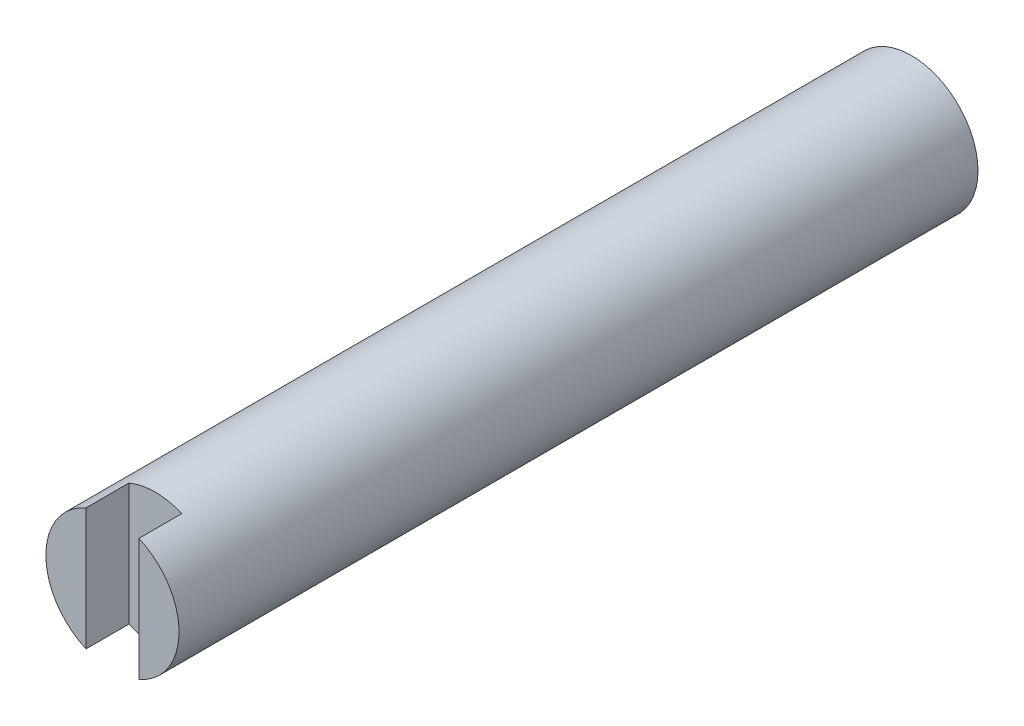
ISO-10303-21;
HEADER;
FILE_DESCRIPTION(('STEP AP214'),'2;1');
FILE_NAME('part.step','',(''),(''),'','','');
FILE_SCHEMA(('AUTOMOTIVE_DESIGN { 1 0 10303 214 1 1 1 1 }'));
ENDSEC;
DATA;
#1=APPLICATION_CONTEXT('core data for automotive mechanical design processes');
#2=APPLICATION_PROTOCOL_DEFINITION('international standard','automotive_design',2000,#1);
#3=PRODUCT_CONTEXT('',#1,'mechanical');
#4=PRODUCT('Part','Part','',(#3));
#5=PRODUCT_RELATED_PRODUCT_CATEGORY('part','',(#4));
#6=PRODUCT_DEFINITION_FORMATION('','',#4);
#7=PRODUCT_DEFINITION_CONTEXT('part definition',#1,'design');
#8=PRODUCT_DEFINITION('design','',#6,#7);
#9=PRODUCT_DEFINITION_SHAPE('','',#8);
#10=(LENGTH_UNIT() NAMED_UNIT(*) SI_UNIT(.MILLI.,.METRE.));
#11=(NAMED_UNIT(*) PLANE_ANGLE_UNIT() SI_UNIT($,.RADIAN.));
#12=(NAMED_UNIT(*) SI_UNIT($,.STERADIAN.) SOLID_ANGLE_UNIT());
#13=UNCERTAINTY_MEASURE_WITH_UNIT(LENGTH_MEASURE(1.E-05),#10,'distance_accuracy_value','');
#14=(GEOMETRIC_REPRESENTATION_CONTEXT(3) GLOBAL_UNCERTAINTY_ASSIGNED_CONTEXT((#13)) GLOBAL_UNIT_ASSIGNED_CONTEXT((#10,
#11,#12)) REPRESENTATION_CONTEXT('',''));
#15=CARTESIAN_POINT('',(0.,0.,0.));
#16=DIRECTION('',(0.,0.,1.));
#17=DIRECTION('',(1.,0.,0.));
#18=AXIS2_PLACEMENT_3D('',#15,#16,#17);
#19=CARTESIAN_POINT('',(0.,0.,160.));
#20=DIRECTION('',(0.,0.,1.));
#21=DIRECTION('',(1.,0.,0.));
#22=AXIS2_PLACEMENT_3D('',#19,#20,#21);
#23=PLANE('',#22);
#24=DIRECTION('',(0.,-1.,0.));
#25=VECTOR('',#24,1.);
#26=CARTESIAN_POINT('',(-4.96854738755115,0.,160.));
#27=LINE('',#26,#25);
#28=CARTESIAN_POINT('',(-4.96854738755115,11.4701149452679,160.));
#29=VERTEX_POINT('',#28);
#30=CARTESIAN_POINT('',(-4.96854738755115,-11.4701149452679,160.));
#31=VERTEX_POINT('',#30);
#32=EDGE_CURVE('E54',#29,#31,#27,.T.);
#33=ORIENTED_EDGE('',*,*,#32,.F.);
#34=CARTESIAN_POINT('',(0.,0.,160.));
#35=DIRECTION('',(0.,0.,1.));
#36=DIRECTION('',(1.,0.,0.));
#37=AXIS2_PLACEMENT_3D('',#34,#35,#36);
#38=CIRCLE('',#37,12.5);
#39=EDGE_CURVE('E97',#29,#31,#38,.T.);
#40=ORIENTED_EDGE('',*,*,#39,.T.);
#41=EDGE_LOOP('',(#33,#40));
#42=FACE_BOUND('',#41,.T.);
#43=ADVANCED_FACE('F31',(#42),#23,.T.);
#44=CARTESIAN_POINT('',(0.,0.,160.));
#45=DIRECTION('',(0.,0.,-1.));
#46=DIRECTION('',(-1.,0.,0.));
#47=AXIS2_PLACEMENT_3D('',#44,#45,#46);
#48=CYLINDRICAL_SURFACE('',#47,12.5);
#49=CARTESIAN_POINT('',(0.,0.,151.96207223526));
#50=DIRECTION('',(0.,0.,-1.));
#51=DIRECTION('',(-1.,0.,0.));
#52=AXIS2_PLACEMENT_3D('',#49,#50,#51);
#53=CIRCLE('',#52,12.5);
#54=CARTESIAN_POINT('',(4.96557164452471,-11.4714034992712,151.96207223526));
#55=VERTEX_POINT('',#54);
#56=CARTESIAN_POINT('',(-4.96854738755115,-11.4701149452679,151.96207223526));
#57=VERTEX_POINT('',#56);
#58=EDGE_CURVE('E11',#55,#57,#53,.T.);
#59=ORIENTED_EDGE('',*,*,#58,.T.);
#60=DIRECTION('',(0.,0.,-1.));
#61=VECTOR('',#60,1.);
#62=CARTESIAN_POINT('',(-4.96854738755115,-11.4701149452679,160.));
#63=LINE('',#62,#61);
#64=EDGE_CURVE('E87',#57,#31,#63,.F.);
#65=ORIENTED_EDGE('',*,*,#64,.T.);
#66=ORIENTED_EDGE('',*,*,#39,.F.);
#67=DIRECTION('',(0.,0.,-1.));
#68=VECTOR('',#67,1.);
#69=CARTESIAN_POINT('',(-4.96854738755115,11.4701149452679,160.));
#70=LINE('',#69,#68);
#71=CARTESIAN_POINT('',(-4.96854738755115,11.4701149452679,151.96207223526));
#72=VERTEX_POINT('',#71);
#73=EDGE_CURVE('E89',#29,#72,#70,.T.);
#74=ORIENTED_EDGE('',*,*,#73,.T.);
#75=CARTESIAN_POINT('',(4.96557164452471,11.4714034992712,151.96207223526));
#76=VERTEX_POINT('',#75);
#77=EDGE_CURVE('E35',#72,#76,#53,.T.);
#78=ORIENTED_EDGE('',*,*,#77,.T.);
#79=DIRECTION('',(0.,0.,-1.));
#80=VECTOR('',#79,1.);
#81=CARTESIAN_POINT('',(4.96557164452471,11.4714034992712,160.));
#82=LINE('',#81,#80);
#83=CARTESIAN_POINT('',(4.96557164452471,11.4714034992712,160.));
#84=VERTEX_POINT('',#83);
#85=EDGE_CURVE('E81',#76,#84,#82,.F.);
#86=ORIENTED_EDGE('',*,*,#85,.T.);
#87=CARTESIAN_POINT('',(4.96557164452471,-11.4714034992712,160.));
#88=VERTEX_POINT('',#87);
#89=EDGE_CURVE('E86',#88,#84,#38,.T.);
#90=ORIENTED_EDGE('',*,*,#89,.F.);
#91=DIRECTION('',(0.,0.,-1.));
#92=VECTOR('',#91,1.);
#93=CARTESIAN_POINT('',(4.96557164452471,-11.4714034992712,160.));
#94=LINE('',#93,#92);
#95=EDGE_CURVE('E46',#88,#55,#94,.T.);
#96=ORIENTED_EDGE('',*,*,#95,.T.);
#97=EDGE_LOOP('',(#59,#65,#66,#74,#78,#86,#90,#96));
#98=FACE_BOUND('',#97,.T.);
#99=CARTESIAN_POINT('',(0.,0.,10.));
#100=DIRECTION('',(0.,0.,1.));
#101=DIRECTION('',(1.,0.,0.));
#102=AXIS2_PLACEMENT_3D('',#99,#100,#101);
#103=CIRCLE('',#102,12.5);
#104=CARTESIAN_POINT('',(12.5,0.,10.));
#105=VERTEX_POINT('',#104);
#106=EDGE_CURVE('E95',#105,#105,#103,.T.);
#107=ORIENTED_EDGE('',*,*,#106,.T.);
#108=EDGE_LOOP('',(#107));
#109=FACE_BOUND('',#108,.T.);
#110=ADVANCED_FACE('F33',(#98,#109),#48,.T.);
#111=DIRECTION('',(0.,1.,0.));
#112=VECTOR('',#111,1.);
#113=CARTESIAN_POINT('',(4.96557164452471,0.,160.));
#114=LINE('',#113,#112);
#115=EDGE_CURVE('E100',#88,#84,#114,.T.);
#116=ORIENTED_EDGE('',*,*,#115,.F.);
#117=ORIENTED_EDGE('',*,*,#89,.T.);
#118=EDGE_LOOP('',(#116,#117));
#119=FACE_BOUND('',#118,.T.);
#120=ADVANCED_FACE('F108',(#119),#23,.T.);
#121=CARTESIAN_POINT('',(0.,0.,10.));
#122=DIRECTION('',(0.,0.,1.));
#123=DIRECTION('',(1.,0.,0.));
#124=AXIS2_PLACEMENT_3D('',#121,#122,#123);
#125=PLANE('',#124);
#126=ORIENTED_EDGE('',*,*,#106,.F.);
#127=EDGE_LOOP('',(#126));
#128=FACE_BOUND('',#127,.T.);
#129=ADVANCED_FACE('F114',(#128),#125,.F.);
#130=CARTESIAN_POINT('',(-4.96854738755115,-35.,151.96207223526));
#131=DIRECTION('',(0.,0.,-1.));
#132=DIRECTION('',(-1.,0.,0.));
#133=AXIS2_PLACEMENT_3D('',#130,#131,#132);
#134=PLANE('',#133);
#135=DIRECTION('',(0.,1.,0.));
#136=VECTOR('',#135,1.);
#137=CARTESIAN_POINT('',(-4.96854738755115,-35.,151.96207223526));
#138=LINE('',#137,#136);
#139=EDGE_CURVE('E77',#57,#72,#138,.T.);
#140=ORIENTED_EDGE('',*,*,#139,.F.);
#141=ORIENTED_EDGE('',*,*,#58,.F.);
#142=DIRECTION('',(0.,1.,0.));
#143=VECTOR('',#142,1.);
#144=CARTESIAN_POINT('',(4.96557164452471,-35.,151.96207223526));
#145=LINE('',#144,#143);
#146=EDGE_CURVE('E74',#55,#76,#145,.T.);
#147=ORIENTED_EDGE('',*,*,#146,.T.);
#148=ORIENTED_EDGE('',*,*,#77,.F.);
#149=EDGE_LOOP('',(#140,#141,#147,#148));
#150=FACE_BOUND('',#149,.T.);
#151=ADVANCED_FACE('F73',(#150),#134,.F.);
#152=CARTESIAN_POINT('',(-4.96854738755115,-35.,151.96207223526));
#153=DIRECTION('',(-1.,0.,0.));
#154=DIRECTION('',(0.,0.,1.));
#155=AXIS2_PLACEMENT_3D('',#152,#153,#154);
#156=PLANE('',#155);
#157=ORIENTED_EDGE('',*,*,#32,.T.);
#158=ORIENTED_EDGE('',*,*,#64,.F.);
#159=ORIENTED_EDGE('',*,*,#139,.T.);
#160=ORIENTED_EDGE('',*,*,#73,.F.);
#161=EDGE_LOOP('',(#157,#158,#159,#160));
#162=FACE_BOUND('',#161,.T.);
#163=ADVANCED_FACE('F102',(#162),#156,.F.);
#164=CARTESIAN_POINT('',(4.96557164452471,-35.,151.96207223526));
#165=DIRECTION('',(1.,0.,0.));
#166=DIRECTION('',(0.,0.,-1.));
#167=AXIS2_PLACEMENT_3D('',#164,#165,#166);
#168=PLANE('',#167);
#169=ORIENTED_EDGE('',*,*,#115,.T.);
#170=ORIENTED_EDGE('',*,*,#85,.F.);
#171=ORIENTED_EDGE('',*,*,#146,.F.);
#172=ORIENTED_EDGE('',*,*,#95,.F.);
#173=EDGE_LOOP('',(#169,#170,#171,#172));
#174=FACE_BOUND('',#173,.T.);
#175=ADVANCED_FACE('F79',(#174),#168,.F.);
#176=CLOSED_SHELL('',(#43,#110,#120,#129,#151,#163,#175));
#177=MANIFOLD_SOLID_BREP('B2',#176);
#178=ADVANCED_BREP_SHAPE_REPRESENTATION('',(#18,#177),#14);
#179=SHAPE_DEFINITION_REPRESENTATION(#9,#178);
ENDSEC;
END-ISO-10303-21;
